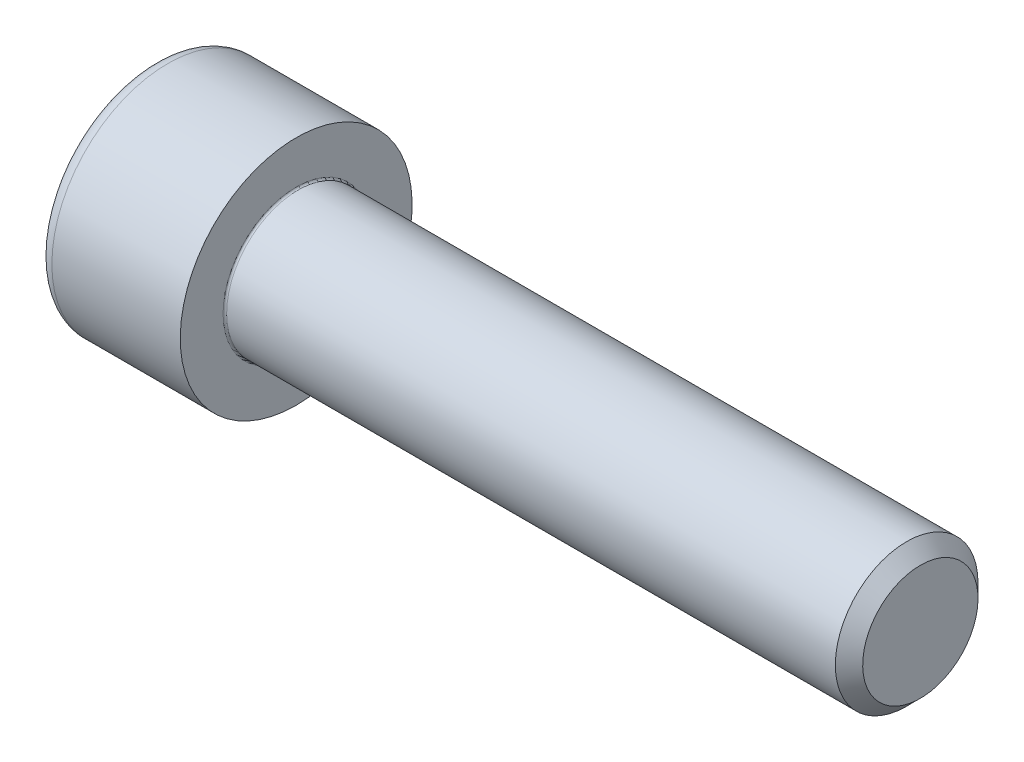
ISO-10303-21;
HEADER;
FILE_DESCRIPTION(('STEP AP214'),'2;1');
FILE_NAME('part.step','',(''),(''),'','','');
FILE_SCHEMA(('AUTOMOTIVE_DESIGN { 1 0 10303 214 1 1 1 1 }'));
ENDSEC;
DATA;
#1=APPLICATION_CONTEXT('core data for automotive mechanical design processes');
#2=APPLICATION_PROTOCOL_DEFINITION('international standard','automotive_design',2000,#1);
#3=PRODUCT_CONTEXT('',#1,'mechanical');
#4=PRODUCT('Part','Part','',(#3));
#5=PRODUCT_RELATED_PRODUCT_CATEGORY('part','',(#4));
#6=PRODUCT_DEFINITION_FORMATION('','',#4);
#7=PRODUCT_DEFINITION_CONTEXT('part definition',#1,'design');
#8=PRODUCT_DEFINITION('design','',#6,#7);
#9=PRODUCT_DEFINITION_SHAPE('','',#8);
#10=(LENGTH_UNIT() NAMED_UNIT(*) SI_UNIT(.MILLI.,.METRE.));
#11=(NAMED_UNIT(*) PLANE_ANGLE_UNIT() SI_UNIT($,.RADIAN.));
#12=(NAMED_UNIT(*) SI_UNIT($,.STERADIAN.) SOLID_ANGLE_UNIT());
#13=UNCERTAINTY_MEASURE_WITH_UNIT(LENGTH_MEASURE(1.E-05),#10,'distance_accuracy_value','');
#14=(GEOMETRIC_REPRESENTATION_CONTEXT(3) GLOBAL_UNCERTAINTY_ASSIGNED_CONTEXT((#13)) GLOBAL_UNIT_ASSIGNED_CONTEXT((#10,
#11,#12)) REPRESENTATION_CONTEXT('',''));
#15=CARTESIAN_POINT('',(0.,0.,0.));
#16=DIRECTION('',(0.,0.,1.));
#17=DIRECTION('',(1.,0.,0.));
#18=AXIS2_PLACEMENT_3D('',#15,#16,#17);
#19=CARTESIAN_POINT('',(-3.,0.,0.));
#20=DIRECTION('',(-1.,0.,0.));
#21=DIRECTION('',(0.,1.,0.));
#22=AXIS2_PLACEMENT_3D('',#19,#20,#21);
#23=CONICAL_SURFACE('',#22,1.73205080756888,1.0471975511966);
#24=DIRECTION('',(-0.5,-0.866025403784439,0.));
#25=VECTOR('',#24,1.);
#26=CARTESIAN_POINT('',(-3.,-1.73205080756888,0.));
#27=LINE('',#26,#25);
#28=CARTESIAN_POINT('',(-2.,0.,0.));
#29=VERTEX_POINT('',#28);
#30=CARTESIAN_POINT('',(-3.73205080756887,-3.,0.));
#31=VERTEX_POINT('',#30);
#32=EDGE_CURVE('E11',#29,#31,#27,.T.);
#33=ORIENTED_EDGE('',*,*,#32,.T.);
#34=CARTESIAN_POINT('',(-3.73205080756887,-3.,0.));
#35=CARTESIAN_POINT('',(-3.73205080756887,-3.,0.803847577293371));
#36=CARTESIAN_POINT('',(-4.,-3.,1.73205080756889));
#37=(BOUNDED_CURVE() B_SPLINE_CURVE(2,(#34,#35,#36),.UNSPECIFIED.,.F.,
.F.) B_SPLINE_CURVE_WITH_KNOTS((3,3),(0.175265420711689,0.350530841423377),
.UNSPECIFIED.) CURVE() GEOMETRIC_REPRESENTATION_ITEM() RATIONAL_B_SPLINE_CURVE((1.07735026918963,
1.07735026918963,1.)) REPRESENTATION_ITEM(''));
#38=CARTESIAN_POINT('',(-4.,-3.,1.73205080756888));
#39=VERTEX_POINT('',#38);
#40=EDGE_CURVE('E196',#31,#39,#37,.T.);
#41=ORIENTED_EDGE('',*,*,#40,.T.);
#42=CARTESIAN_POINT('',(-4.,-3.,1.73205080756887));
#43=CARTESIAN_POINT('',(-3.49999999999999,-1.5,2.59807621135332));
#44=CARTESIAN_POINT('',(-4.,0.,3.46410161513776));
#45=(BOUNDED_CURVE() B_SPLINE_CURVE(2,(#42,#43,#44),.UNSPECIFIED.,.F.,
.F.) B_SPLINE_CURVE_WITH_KNOTS((3,3),(0.,0.350530841423377),
.UNSPECIFIED.) CURVE() GEOMETRIC_REPRESENTATION_ITEM() RATIONAL_B_SPLINE_CURVE((1.,
1.15470053837925,1.)) REPRESENTATION_ITEM(''));
#46=CARTESIAN_POINT('',(-4.,0.,3.46410161513775));
#47=VERTEX_POINT('',#46);
#48=EDGE_CURVE('E30',#39,#47,#45,.T.);
#49=ORIENTED_EDGE('',*,*,#48,.T.);
#50=CARTESIAN_POINT('',(-4.,0.,3.46410161513776));
#51=CARTESIAN_POINT('',(-3.49999999999999,1.5,2.59807621135332));
#52=CARTESIAN_POINT('',(-4.,3.,1.73205080756887));
#53=(BOUNDED_CURVE() B_SPLINE_CURVE(2,(#50,#51,#52),.UNSPECIFIED.,.F.,
.F.) B_SPLINE_CURVE_WITH_KNOTS((3,3),(0.,0.350530841423377),
.UNSPECIFIED.) CURVE() GEOMETRIC_REPRESENTATION_ITEM() RATIONAL_B_SPLINE_CURVE((1.,
1.15470053837925,1.)) REPRESENTATION_ITEM(''));
#54=CARTESIAN_POINT('',(-4.,3.,1.73205080756888));
#55=VERTEX_POINT('',#54);
#56=EDGE_CURVE('E175',#47,#55,#53,.T.);
#57=ORIENTED_EDGE('',*,*,#56,.T.);
#58=CARTESIAN_POINT('',(-4.,3.,1.73205080756888));
#59=CARTESIAN_POINT('',(-3.49999999999999,3.,0.));
#60=CARTESIAN_POINT('',(-4.,3.,-1.73205080756889));
#61=(BOUNDED_CURVE() B_SPLINE_CURVE(2,(#58,#59,#60),.UNSPECIFIED.,.F.,
.F.) B_SPLINE_CURVE_WITH_KNOTS((3,3),(0.,0.350530841423377),
.UNSPECIFIED.) CURVE() GEOMETRIC_REPRESENTATION_ITEM() RATIONAL_B_SPLINE_CURVE((1.,
1.15470053837925,1.)) REPRESENTATION_ITEM(''));
#62=CARTESIAN_POINT('',(-4.,3.,-1.73205080756888));
#63=VERTEX_POINT('',#62);
#64=EDGE_CURVE('E21',#55,#63,#61,.T.);
#65=ORIENTED_EDGE('',*,*,#64,.T.);
#66=CARTESIAN_POINT('',(-4.,3.,-1.73205080756887));
#67=CARTESIAN_POINT('',(-3.49999999999999,1.5,-2.59807621135332));
#68=CARTESIAN_POINT('',(-4.,0.,-3.46410161513776));
#69=(BOUNDED_CURVE() B_SPLINE_CURVE(2,(#66,#67,#68),.UNSPECIFIED.,.F.,
.F.) B_SPLINE_CURVE_WITH_KNOTS((3,3),(0.,0.350530841423377),
.UNSPECIFIED.) CURVE() GEOMETRIC_REPRESENTATION_ITEM() RATIONAL_B_SPLINE_CURVE((1.,
1.15470053837925,1.)) REPRESENTATION_ITEM(''));
#70=CARTESIAN_POINT('',(-4.,0.,-3.46410161513775));
#71=VERTEX_POINT('',#70);
#72=EDGE_CURVE('E134',#63,#71,#69,.T.);
#73=ORIENTED_EDGE('',*,*,#72,.T.);
#74=CARTESIAN_POINT('',(-4.,0.,-3.46410161513776));
#75=CARTESIAN_POINT('',(-3.49999999999999,-1.5,-2.59807621135332));
#76=CARTESIAN_POINT('',(-4.,-3.,-1.73205080756887));
#77=(BOUNDED_CURVE() B_SPLINE_CURVE(2,(#74,#75,#76),.UNSPECIFIED.,.F.,
.F.) B_SPLINE_CURVE_WITH_KNOTS((3,3),(0.,0.350530841423377),
.UNSPECIFIED.) CURVE() GEOMETRIC_REPRESENTATION_ITEM() RATIONAL_B_SPLINE_CURVE((1.,
1.15470053837925,1.)) REPRESENTATION_ITEM(''));
#78=CARTESIAN_POINT('',(-4.,-3.,-1.73205080756888));
#79=VERTEX_POINT('',#78);
#80=EDGE_CURVE('E178',#71,#79,#77,.T.);
#81=ORIENTED_EDGE('',*,*,#80,.T.);
#82=CARTESIAN_POINT('',(-4.,-3.,-1.73205080756889));
#83=CARTESIAN_POINT('',(-3.73205080756887,-3.,-0.803847577293371));
#84=CARTESIAN_POINT('',(-3.73205080756887,-3.,0.));
#85=(BOUNDED_CURVE() B_SPLINE_CURVE(2,(#82,#83,#84),.UNSPECIFIED.,.F.,
.F.) B_SPLINE_CURVE_WITH_KNOTS((3,3),(0.,0.175265420711689),
.UNSPECIFIED.) CURVE() GEOMETRIC_REPRESENTATION_ITEM() RATIONAL_B_SPLINE_CURVE((1.,
1.07735026918963,1.07735026918963)) REPRESENTATION_ITEM(''));
#86=EDGE_CURVE('E188',#79,#31,#85,.T.);
#87=ORIENTED_EDGE('',*,*,#86,.T.);
#88=ORIENTED_EDGE('',*,*,#32,.F.);
#89=EDGE_LOOP('',(#33,#41,#49,#57,#65,#73,#81,#87,#88));
#90=FACE_BOUND('',#89,.T.);
#91=ADVANCED_FACE('F17',(#90),#23,.F.);
#92=CARTESIAN_POINT('',(-8.,-3.,1.73205080756888));
#93=DIRECTION('',(0.,-0.5,0.866025403784439));
#94=DIRECTION('',(-1.,0.,0.));
#95=AXIS2_PLACEMENT_3D('',#92,#93,#94);
#96=PLANE('',#95);
#97=ORIENTED_EDGE('',*,*,#48,.F.);
#98=DIRECTION('',(-1.,0.,0.));
#99=VECTOR('',#98,1.);
#100=CARTESIAN_POINT('',(-6.,-3.,1.73205080756888));
#101=LINE('',#100,#99);
#102=CARTESIAN_POINT('',(-8.,-3.,1.73205080756888));
#103=VERTEX_POINT('',#102);
#104=EDGE_CURVE('E194',#39,#103,#101,.T.);
#105=ORIENTED_EDGE('',*,*,#104,.T.);
#106=DIRECTION('',(0.,-0.866025403784439,-0.5));
#107=VECTOR('',#106,1.);
#108=CARTESIAN_POINT('',(-8.,-2.25,2.1650635094611));
#109=LINE('',#108,#107);
#110=CARTESIAN_POINT('',(-8.,0.,3.46410161513775));
#111=VERTEX_POINT('',#110);
#112=EDGE_CURVE('E164',#111,#103,#109,.T.);
#113=ORIENTED_EDGE('',*,*,#112,.F.);
#114=DIRECTION('',(1.,0.,0.));
#115=VECTOR('',#114,1.);
#116=CARTESIAN_POINT('',(-6.,0.,3.46410161513775));
#117=LINE('',#116,#115);
#118=EDGE_CURVE('E185',#111,#47,#117,.T.);
#119=ORIENTED_EDGE('',*,*,#118,.T.);
#120=EDGE_LOOP('',(#97,#105,#113,#119));
#121=FACE_BOUND('',#120,.T.);
#122=ADVANCED_FACE('F362',(#121),#96,.F.);
#123=CARTESIAN_POINT('',(-8.,-3.,-1.73205080756888));
#124=DIRECTION('',(0.,-1.,0.));
#125=DIRECTION('',(-1.,0.,0.));
#126=AXIS2_PLACEMENT_3D('',#123,#124,#125);
#127=PLANE('',#126);
#128=ORIENTED_EDGE('',*,*,#86,.F.);
#129=DIRECTION('',(-1.,0.,0.));
#130=VECTOR('',#129,1.);
#131=CARTESIAN_POINT('',(-6.,-3.,-1.73205080756888));
#132=LINE('',#131,#130);
#133=CARTESIAN_POINT('',(-8.,-3.,-1.73205080756888));
#134=VERTEX_POINT('',#133);
#135=EDGE_CURVE('E201',#79,#134,#132,.T.);
#136=ORIENTED_EDGE('',*,*,#135,.T.);
#137=DIRECTION('',(0.,0.,-1.));
#138=VECTOR('',#137,1.);
#139=CARTESIAN_POINT('',(-8.,-3.,-0.866025403784438));
#140=LINE('',#139,#138);
#141=EDGE_CURVE('E193',#103,#134,#140,.T.);
#142=ORIENTED_EDGE('',*,*,#141,.F.);
#143=ORIENTED_EDGE('',*,*,#104,.F.);
#144=ORIENTED_EDGE('',*,*,#40,.F.);
#145=EDGE_LOOP('',(#128,#136,#142,#143,#144));
#146=FACE_BOUND('',#145,.T.);
#147=ADVANCED_FACE('F300',(#146),#127,.F.);
#148=CARTESIAN_POINT('',(-8.,0.,3.46410161513775));
#149=DIRECTION('',(0.,0.5,0.866025403784439));
#150=DIRECTION('',(1.,0.,0.));
#151=AXIS2_PLACEMENT_3D('',#148,#149,#150);
#152=PLANE('',#151);
#153=ORIENTED_EDGE('',*,*,#56,.F.);
#154=ORIENTED_EDGE('',*,*,#118,.F.);
#155=DIRECTION('',(0.,-0.866025403784439,0.5));
#156=VECTOR('',#155,1.);
#157=CARTESIAN_POINT('',(-8.,0.75,3.03108891324554));
#158=LINE('',#157,#156);
#159=CARTESIAN_POINT('',(-8.,3.,1.73205080756888));
#160=VERTEX_POINT('',#159);
#161=EDGE_CURVE('E156',#160,#111,#158,.T.);
#162=ORIENTED_EDGE('',*,*,#161,.F.);
#163=DIRECTION('',(-1.,0.,0.));
#164=VECTOR('',#163,1.);
#165=CARTESIAN_POINT('',(-6.,3.,1.73205080756888));
#166=LINE('',#165,#164);
#167=EDGE_CURVE('E153',#55,#160,#166,.T.);
#168=ORIENTED_EDGE('',*,*,#167,.F.);
#169=EDGE_LOOP('',(#153,#154,#162,#168));
#170=FACE_BOUND('',#169,.T.);
#171=ADVANCED_FACE('F399',(#170),#152,.F.);
#172=CARTESIAN_POINT('',(-8.,3.,1.73205080756888));
#173=DIRECTION('',(0.,1.,0.));
#174=DIRECTION('',(0.,0.,-1.));
#175=AXIS2_PLACEMENT_3D('',#172,#173,#174);
#176=PLANE('',#175);
#177=ORIENTED_EDGE('',*,*,#64,.F.);
#178=ORIENTED_EDGE('',*,*,#167,.T.);
#179=DIRECTION('',(0.,0.,1.));
#180=VECTOR('',#179,1.);
#181=CARTESIAN_POINT('',(-8.,3.,0.866025403784437));
#182=LINE('',#181,#180);
#183=CARTESIAN_POINT('',(-8.,3.,-1.73205080756888));
#184=VERTEX_POINT('',#183);
#185=EDGE_CURVE('E144',#184,#160,#182,.T.);
#186=ORIENTED_EDGE('',*,*,#185,.F.);
#187=DIRECTION('',(-1.,0.,0.));
#188=VECTOR('',#187,1.);
#189=CARTESIAN_POINT('',(-6.,3.,-1.73205080756888));
#190=LINE('',#189,#188);
#191=EDGE_CURVE('E128',#63,#184,#190,.T.);
#192=ORIENTED_EDGE('',*,*,#191,.F.);
#193=EDGE_LOOP('',(#177,#178,#186,#192));
#194=FACE_BOUND('',#193,.T.);
#195=ADVANCED_FACE('F151',(#194),#176,.F.);
#196=CARTESIAN_POINT('',(-8.,3.,-1.73205080756888));
#197=DIRECTION('',(0.,0.5,-0.866025403784439));
#198=DIRECTION('',(-1.,0.,0.));
#199=AXIS2_PLACEMENT_3D('',#196,#197,#198);
#200=PLANE('',#199);
#201=ORIENTED_EDGE('',*,*,#72,.F.);
#202=ORIENTED_EDGE('',*,*,#191,.T.);
#203=DIRECTION('',(0.,0.866025403784439,0.5));
#204=VECTOR('',#203,1.);
#205=CARTESIAN_POINT('',(-8.,2.25,-2.1650635094611));
#206=LINE('',#205,#204);
#207=CARTESIAN_POINT('',(-8.,0.,-3.46410161513775));
#208=VERTEX_POINT('',#207);
#209=EDGE_CURVE('E132',#208,#184,#206,.T.);
#210=ORIENTED_EDGE('',*,*,#209,.F.);
#211=DIRECTION('',(-1.,0.,0.));
#212=VECTOR('',#211,1.);
#213=CARTESIAN_POINT('',(-6.,0.,-3.46410161513775));
#214=LINE('',#213,#212);
#215=EDGE_CURVE('E198',#71,#208,#214,.T.);
#216=ORIENTED_EDGE('',*,*,#215,.F.);
#217=EDGE_LOOP('',(#201,#202,#210,#216));
#218=FACE_BOUND('',#217,.T.);
#219=ADVANCED_FACE('F130',(#218),#200,.F.);
#220=CARTESIAN_POINT('',(-8.,0.,-3.46410161513775));
#221=DIRECTION('',(0.,-0.5,-0.866025403784439));
#222=DIRECTION('',(0.,-0.866025403784439,0.5));
#223=AXIS2_PLACEMENT_3D('',#220,#221,#222);
#224=PLANE('',#223);
#225=ORIENTED_EDGE('',*,*,#80,.F.);
#226=ORIENTED_EDGE('',*,*,#215,.T.);
#227=DIRECTION('',(0.,0.866025403784439,-0.5));
#228=VECTOR('',#227,1.);
#229=CARTESIAN_POINT('',(-8.,-0.75,-3.03108891324554));
#230=LINE('',#229,#228);
#231=EDGE_CURVE('E147',#134,#208,#230,.T.);
#232=ORIENTED_EDGE('',*,*,#231,.F.);
#233=ORIENTED_EDGE('',*,*,#135,.F.);
#234=EDGE_LOOP('',(#225,#226,#232,#233));
#235=FACE_BOUND('',#234,.T.);
#236=ADVANCED_FACE('F305',(#235),#224,.F.);
#237=CARTESIAN_POINT('',(-4.,0.,0.));
#238=DIRECTION('',(1.,0.,0.));
#239=DIRECTION('',(0.,1.,0.));
#240=AXIS2_PLACEMENT_3D('',#237,#238,#239);
#241=CYLINDRICAL_SURFACE('',#240,6.5);
#242=CARTESIAN_POINT('',(0.,0.,0.));
#243=DIRECTION('',(1.,0.,0.));
#244=DIRECTION('',(0.,1.,0.));
#245=AXIS2_PLACEMENT_3D('',#242,#243,#244);
#246=CIRCLE('',#245,6.5);
#247=CARTESIAN_POINT('',(0.,-6.5,0.));
#248=VERTEX_POINT('',#247);
#249=EDGE_CURVE('E240',#248,#248,#246,.T.);
#250=ORIENTED_EDGE('',*,*,#249,.F.);
#251=DIRECTION('',(-1.,0.,0.));
#252=VECTOR('',#251,1.);
#253=CARTESIAN_POINT('',(-4.,-6.5,0.));
#254=LINE('',#253,#252);
#255=CARTESIAN_POINT('',(-7.2,-6.5,0.));
#256=VERTEX_POINT('',#255);
#257=EDGE_CURVE('E149',#248,#256,#254,.T.);
#258=ORIENTED_EDGE('',*,*,#257,.T.);
#259=CARTESIAN_POINT('',(-7.2,0.,0.));
#260=DIRECTION('',(-1.,0.,0.));
#261=DIRECTION('',(0.,-1.,0.));
#262=AXIS2_PLACEMENT_3D('',#259,#260,#261);
#263=CIRCLE('',#262,6.5);
#264=CARTESIAN_POINT('',(-7.2,0.,6.5));
#265=VERTEX_POINT('',#264);
#266=EDGE_CURVE('E182',#265,#256,#263,.T.);
#267=ORIENTED_EDGE('',*,*,#266,.F.);
#268=CARTESIAN_POINT('',(-7.2,0.,0.));
#269=DIRECTION('',(-1.,0.,0.));
#270=DIRECTION('',(0.,-1.,0.));
#271=AXIS2_PLACEMENT_3D('',#268,#269,#270);
#272=CIRCLE('',#271,6.5);
#273=EDGE_CURVE('E227',#256,#265,#272,.T.);
#274=ORIENTED_EDGE('',*,*,#273,.F.);
#275=ORIENTED_EDGE('',*,*,#257,.F.);
#276=EDGE_LOOP('',(#250,#258,#267,#274,#275));
#277=FACE_BOUND('',#276,.T.);
#278=ADVANCED_FACE('F19',(#277),#241,.T.);
#279=CARTESIAN_POINT('',(-8.,4.98205080756888,0.));
#280=DIRECTION('',(-1.,0.,0.));
#281=DIRECTION('',(0.,0.,1.));
#282=AXIS2_PLACEMENT_3D('',#279,#280,#281);
#283=PLANE('',#282);
#284=ORIENTED_EDGE('',*,*,#185,.T.);
#285=ORIENTED_EDGE('',*,*,#161,.T.);
#286=ORIENTED_EDGE('',*,*,#112,.T.);
#287=ORIENTED_EDGE('',*,*,#141,.T.);
#288=ORIENTED_EDGE('',*,*,#231,.T.);
#289=ORIENTED_EDGE('',*,*,#209,.T.);
#290=EDGE_LOOP('',(#284,#285,#286,#287,#288,#289));
#291=FACE_BOUND('',#290,.T.);
#292=CARTESIAN_POINT('',(-8.,0.,0.));
#293=DIRECTION('',(1.,0.,0.));
#294=DIRECTION('',(0.,-1.,0.));
#295=AXIS2_PLACEMENT_3D('',#292,#293,#294);
#296=CIRCLE('',#295,5.7);
#297=CARTESIAN_POINT('',(-8.,0.,5.7));
#298=VERTEX_POINT('',#297);
#299=EDGE_CURVE('E157',#298,#298,#296,.T.);
#300=ORIENTED_EDGE('',*,*,#299,.F.);
#301=EDGE_LOOP('',(#300));
#302=FACE_BOUND('',#301,.T.);
#303=ADVANCED_FACE('F141',(#291,#302),#283,.T.);
#304=CARTESIAN_POINT('',(-7.2,0.,0.));
#305=DIRECTION('',(1.,0.,0.));
#306=DIRECTION('',(0.,0.,-1.));
#307=AXIS2_PLACEMENT_3D('',#304,#305,#306);
#308=TOROIDAL_SURFACE('',#307,5.7,0.8);
#309=ORIENTED_EDGE('',*,*,#266,.T.);
#310=ORIENTED_EDGE('',*,*,#273,.T.);
#311=CARTESIAN_POINT('',(-7.2,0.,5.7));
#312=DIRECTION('',(0.,-1.,0.));
#313=DIRECTION('',(0.,0.,1.));
#314=AXIS2_PLACEMENT_3D('',#311,#312,#313);
#315=CIRCLE('',#314,0.8);
#316=EDGE_CURVE('E166',#265,#298,#315,.T.);
#317=ORIENTED_EDGE('',*,*,#316,.T.);
#318=ORIENTED_EDGE('',*,*,#299,.T.);
#319=ORIENTED_EDGE('',*,*,#316,.F.);
#320=EDGE_LOOP('',(#309,#310,#317,#318,#319));
#321=FACE_BOUND('',#320,.T.);
#322=ADVANCED_FACE('F404',(#321),#308,.T.);
#323=CARTESIAN_POINT('',(35.,2.,0.));
#324=DIRECTION('',(1.,0.,0.));
#325=DIRECTION('',(0.,-1.,0.));
#326=AXIS2_PLACEMENT_3D('',#323,#324,#325);
#327=PLANE('',#326);
#328=CARTESIAN_POINT('',(35.,0.,0.));
#329=DIRECTION('',(-1.,0.,0.));
#330=DIRECTION('',(0.,-1.,0.));
#331=AXIS2_PLACEMENT_3D('',#328,#329,#330);
#332=CIRCLE('',#331,3.2331875);
#333=CARTESIAN_POINT('',(35.,3.2331875,0.));
#334=VERTEX_POINT('',#333);
#335=EDGE_CURVE('E183',#334,#334,#332,.T.);
#336=ORIENTED_EDGE('',*,*,#335,.F.);
#337=EDGE_LOOP('',(#336));
#338=FACE_BOUND('',#337,.T.);
#339=ADVANCED_FACE('F381',(#338),#327,.T.);
#340=CARTESIAN_POINT('',(34.61659375,0.,0.));
#341=DIRECTION('',(-1.,0.,0.));
#342=DIRECTION('',(0.,-1.,0.));
#343=AXIS2_PLACEMENT_3D('',#340,#341,#342);
#344=CONICAL_SURFACE('',#343,3.61659375,0.785398163397447);
#345=ORIENTED_EDGE('',*,*,#335,.T.);
#346=DIRECTION('',(-0.707106781186548,0.707106781186547,0.));
#347=VECTOR('',#346,1.);
#348=CARTESIAN_POINT('',(34.61659375,3.61659375,0.));
#349=LINE('',#348,#347);
#350=CARTESIAN_POINT('',(34.2331875,4.,0.));
#351=VERTEX_POINT('',#350);
#352=EDGE_CURVE('E179',#334,#351,#349,.T.);
#353=ORIENTED_EDGE('',*,*,#352,.T.);
#354=CARTESIAN_POINT('',(34.2331875,0.,0.));
#355=DIRECTION('',(1.,0.,0.));
#356=DIRECTION('',(0.,-1.,0.));
#357=AXIS2_PLACEMENT_3D('',#354,#355,#356);
#358=CIRCLE('',#357,4.);
#359=CARTESIAN_POINT('',(34.2331875,-4.,0.));
#360=VERTEX_POINT('',#359);
#361=EDGE_CURVE('E205',#351,#360,#358,.T.);
#362=ORIENTED_EDGE('',*,*,#361,.T.);
#363=CARTESIAN_POINT('',(34.2331875,0.,0.));
#364=DIRECTION('',(1.,0.,0.));
#365=DIRECTION('',(0.,-1.,0.));
#366=AXIS2_PLACEMENT_3D('',#363,#364,#365);
#367=CIRCLE('',#366,4.);
#368=EDGE_CURVE('E216',#360,#351,#367,.T.);
#369=ORIENTED_EDGE('',*,*,#368,.T.);
#370=ORIENTED_EDGE('',*,*,#352,.F.);
#371=EDGE_LOOP('',(#345,#353,#362,#369,#370));
#372=FACE_BOUND('',#371,.T.);
#373=ADVANCED_FACE('F375',(#372),#344,.T.);
#374=CARTESIAN_POINT('',(0.,5.25,0.));
#375=DIRECTION('',(1.,0.,0.));
#376=DIRECTION('',(0.,-1.,0.));
#377=AXIS2_PLACEMENT_3D('',#374,#375,#376);
#378=PLANE('',#377);
#379=CARTESIAN_POINT('',(0.,0.,0.));
#380=DIRECTION('',(1.,0.,0.));
#381=DIRECTION('',(0.,-1.,0.));
#382=AXIS2_PLACEMENT_3D('',#379,#380,#381);
#383=CIRCLE('',#382,4.1);
#384=CARTESIAN_POINT('',(0.,0.,4.1));
#385=VERTEX_POINT('',#384);
#386=EDGE_CURVE('E217',#385,#385,#383,.T.);
#387=ORIENTED_EDGE('',*,*,#386,.F.);
#388=EDGE_LOOP('',(#387));
#389=FACE_BOUND('',#388,.T.);
#390=ORIENTED_EDGE('',*,*,#249,.T.);
#391=EDGE_LOOP('',(#390));
#392=FACE_BOUND('',#391,.T.);
#393=ADVANCED_FACE('F380',(#389,#392),#378,.T.);
#394=CARTESIAN_POINT('',(24.,0.,0.));
#395=DIRECTION('',(1.,0.,0.));
#396=DIRECTION('',(0.,1.,0.));
#397=AXIS2_PLACEMENT_3D('',#394,#395,#396);
#398=CYLINDRICAL_SURFACE('',#397,4.);
#399=ORIENTED_EDGE('',*,*,#361,.F.);
#400=ORIENTED_EDGE('',*,*,#368,.F.);
#401=DIRECTION('',(-1.,0.,0.));
#402=VECTOR('',#401,1.);
#403=CARTESIAN_POINT('',(24.,-4.,0.));
#404=LINE('',#403,#402);
#405=CARTESIAN_POINT('',(0.100000000000002,-4.,0.));
#406=VERTEX_POINT('',#405);
#407=EDGE_CURVE('E233',#360,#406,#404,.T.);
#408=ORIENTED_EDGE('',*,*,#407,.T.);
#409=CARTESIAN_POINT('',(0.100000000000002,0.,0.));
#410=DIRECTION('',(-1.,0.,0.));
#411=DIRECTION('',(0.,-1.,0.));
#412=AXIS2_PLACEMENT_3D('',#409,#410,#411);
#413=CIRCLE('',#412,4.);
#414=CARTESIAN_POINT('',(0.100000000000002,0.,4.));
#415=VERTEX_POINT('',#414);
#416=EDGE_CURVE('E206',#415,#406,#413,.T.);
#417=ORIENTED_EDGE('',*,*,#416,.F.);
#418=CARTESIAN_POINT('',(0.100000000000002,0.,0.));
#419=DIRECTION('',(-1.,0.,0.));
#420=DIRECTION('',(0.,-1.,0.));
#421=AXIS2_PLACEMENT_3D('',#418,#419,#420);
#422=CIRCLE('',#421,4.);
#423=EDGE_CURVE('E202',#406,#415,#422,.T.);
#424=ORIENTED_EDGE('',*,*,#423,.F.);
#425=ORIENTED_EDGE('',*,*,#407,.F.);
#426=EDGE_LOOP('',(#399,#400,#408,#417,#424,#425));
#427=FACE_BOUND('',#426,.T.);
#428=ADVANCED_FACE('F414',(#427),#398,.T.);
#429=CARTESIAN_POINT('',(0.100000000000002,0.,0.));
#430=DIRECTION('',(1.,0.,0.));
#431=DIRECTION('',(0.,0.,-1.));
#432=AXIS2_PLACEMENT_3D('',#429,#430,#431);
#433=TOROIDAL_SURFACE('',#432,4.1,0.1);
#434=ORIENTED_EDGE('',*,*,#386,.T.);
#435=CARTESIAN_POINT('',(0.100000000000002,0.,4.1));
#436=DIRECTION('',(0.,-1.,0.));
#437=DIRECTION('',(0.,0.,1.));
#438=AXIS2_PLACEMENT_3D('',#435,#436,#437);
#439=CIRCLE('',#438,0.1);
#440=EDGE_CURVE('E212',#385,#415,#439,.T.);
#441=ORIENTED_EDGE('',*,*,#440,.T.);
#442=ORIENTED_EDGE('',*,*,#416,.T.);
#443=ORIENTED_EDGE('',*,*,#423,.T.);
#444=ORIENTED_EDGE('',*,*,#440,.F.);
#445=EDGE_LOOP('',(#434,#441,#442,#443,#444));
#446=FACE_BOUND('',#445,.T.);
#447=ADVANCED_FACE('F419',(#446),#433,.F.);
#448=CLOSED_SHELL('',(#91,#122,#147,#171,#195,#219,#236,#278,#303,#322,#339,#373,#393,#428,#447));
#449=MANIFOLD_SOLID_BREP('B1',#448);
#450=ADVANCED_BREP_SHAPE_REPRESENTATION('',(#18,#449),#14);
#451=SHAPE_DEFINITION_REPRESENTATION(#9,#450);
ENDSEC;
END-ISO-10303-21;
